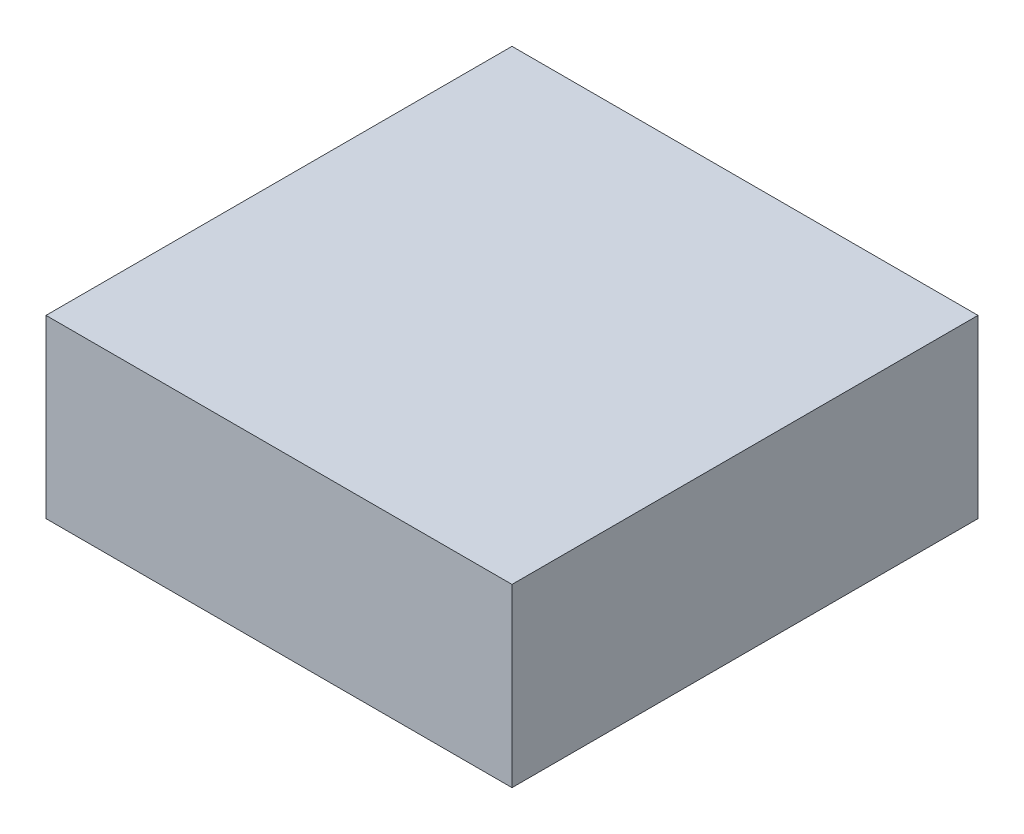
ISO-10303-21;
HEADER;
FILE_DESCRIPTION(('STEP AP214'),'2;1');
FILE_NAME('part.step','',(''),(''),'','','');
FILE_SCHEMA(('AUTOMOTIVE_DESIGN { 1 0 10303 214 1 1 1 1 }'));
ENDSEC;
DATA;
#1=APPLICATION_CONTEXT('core data for automotive mechanical design processes');
#2=APPLICATION_PROTOCOL_DEFINITION('international standard','automotive_design',2000,#1);
#3=PRODUCT_CONTEXT('',#1,'mechanical');
#4=PRODUCT('Part','Part','',(#3));
#5=PRODUCT_RELATED_PRODUCT_CATEGORY('part','',(#4));
#6=PRODUCT_DEFINITION_FORMATION('','',#4);
#7=PRODUCT_DEFINITION_CONTEXT('part definition',#1,'design');
#8=PRODUCT_DEFINITION('design','',#6,#7);
#9=PRODUCT_DEFINITION_SHAPE('','',#8);
#10=(LENGTH_UNIT() NAMED_UNIT(*) SI_UNIT(.MILLI.,.METRE.));
#11=(NAMED_UNIT(*) PLANE_ANGLE_UNIT() SI_UNIT($,.RADIAN.));
#12=(NAMED_UNIT(*) SI_UNIT($,.STERADIAN.) SOLID_ANGLE_UNIT());
#13=UNCERTAINTY_MEASURE_WITH_UNIT(LENGTH_MEASURE(1.E-05),#10,'distance_accuracy_value','');
#14=(GEOMETRIC_REPRESENTATION_CONTEXT(3) GLOBAL_UNCERTAINTY_ASSIGNED_CONTEXT((#13)) GLOBAL_UNIT_ASSIGNED_CONTEXT((#10,
#11,#12)) REPRESENTATION_CONTEXT('',''));
#15=CARTESIAN_POINT('',(0.,0.,0.));
#16=DIRECTION('',(0.,0.,1.));
#17=DIRECTION('',(1.,0.,0.));
#18=AXIS2_PLACEMENT_3D('',#15,#16,#17);
#19=CARTESIAN_POINT('',(-57.5,40.,62.5));
#20=DIRECTION('',(0.,1.,0.));
#21=DIRECTION('',(1.,0.,0.));
#22=AXIS2_PLACEMENT_3D('',#19,#20,#21);
#23=PLANE('',#22);
#24=DIRECTION('',(-1.,0.,0.));
#25=VECTOR('',#24,1.);
#26=CARTESIAN_POINT('',(-35.,40.,85.));
#27=LINE('',#26,#25);
#28=CARTESIAN_POINT('',(-35.,40.,85.));
#29=VERTEX_POINT('',#28);
#30=CARTESIAN_POINT('',(-80.,40.,85.));
#31=VERTEX_POINT('',#30);
#32=EDGE_CURVE('E27',#29,#31,#27,.T.);
#33=ORIENTED_EDGE('',*,*,#32,.T.);
#34=DIRECTION('',(0.,0.,-1.));
#35=VECTOR('',#34,1.);
#36=CARTESIAN_POINT('',(-80.,40.,85.));
#37=LINE('',#36,#35);
#38=CARTESIAN_POINT('',(-80.,40.,40.));
#39=VERTEX_POINT('',#38);
#40=EDGE_CURVE('E73',#31,#39,#37,.T.);
#41=ORIENTED_EDGE('',*,*,#40,.T.);
#42=DIRECTION('',(1.,0.,0.));
#43=VECTOR('',#42,1.);
#44=CARTESIAN_POINT('',(-80.,40.,40.));
#45=LINE('',#44,#43);
#46=CARTESIAN_POINT('',(-35.,40.,40.));
#47=VERTEX_POINT('',#46);
#48=EDGE_CURVE('E98',#39,#47,#45,.T.);
#49=ORIENTED_EDGE('',*,*,#48,.T.);
#50=DIRECTION('',(0.,0.,1.));
#51=VECTOR('',#50,1.);
#52=CARTESIAN_POINT('',(-35.,40.,40.));
#53=LINE('',#52,#51);
#54=EDGE_CURVE('E72',#47,#29,#53,.T.);
#55=ORIENTED_EDGE('',*,*,#54,.T.);
#56=EDGE_LOOP('',(#33,#41,#49,#55));
#57=FACE_BOUND('',#56,.T.);
#58=ADVANCED_FACE('F17',(#57),#23,.F.);
#59=CARTESIAN_POINT('',(-57.5,57.,62.5));
#60=DIRECTION('',(0.,1.,0.));
#61=DIRECTION('',(1.,0.,0.));
#62=AXIS2_PLACEMENT_3D('',#59,#60,#61);
#63=PLANE('',#62);
#64=DIRECTION('',(1.,0.,0.));
#65=VECTOR('',#64,1.);
#66=CARTESIAN_POINT('',(-35.,57.,85.));
#67=LINE('',#66,#65);
#68=CARTESIAN_POINT('',(-80.,57.,85.));
#69=VERTEX_POINT('',#68);
#70=CARTESIAN_POINT('',(-35.,57.,85.));
#71=VERTEX_POINT('',#70);
#72=EDGE_CURVE('E11',#69,#71,#67,.T.);
#73=ORIENTED_EDGE('',*,*,#72,.T.);
#74=DIRECTION('',(0.,0.,-1.));
#75=VECTOR('',#74,1.);
#76=CARTESIAN_POINT('',(-35.,57.,40.));
#77=LINE('',#76,#75);
#78=CARTESIAN_POINT('',(-35.,57.,40.));
#79=VERTEX_POINT('',#78);
#80=EDGE_CURVE('E108',#71,#79,#77,.T.);
#81=ORIENTED_EDGE('',*,*,#80,.T.);
#82=DIRECTION('',(-1.,0.,0.));
#83=VECTOR('',#82,1.);
#84=CARTESIAN_POINT('',(-80.,57.,40.));
#85=LINE('',#84,#83);
#86=CARTESIAN_POINT('',(-80.,57.,40.));
#87=VERTEX_POINT('',#86);
#88=EDGE_CURVE('E101',#79,#87,#85,.T.);
#89=ORIENTED_EDGE('',*,*,#88,.T.);
#90=DIRECTION('',(0.,0.,1.));
#91=VECTOR('',#90,1.);
#92=CARTESIAN_POINT('',(-80.,57.,85.));
#93=LINE('',#92,#91);
#94=EDGE_CURVE('E83',#87,#69,#93,.T.);
#95=ORIENTED_EDGE('',*,*,#94,.T.);
#96=EDGE_LOOP('',(#73,#81,#89,#95));
#97=FACE_BOUND('',#96,.T.);
#98=ADVANCED_FACE('F121',(#97),#63,.T.);
#99=CARTESIAN_POINT('',(-80.,40.,85.));
#100=DIRECTION('',(0.,0.,1.));
#101=DIRECTION('',(1.,0.,0.));
#102=AXIS2_PLACEMENT_3D('',#99,#100,#101);
#103=PLANE('',#102);
#104=ORIENTED_EDGE('',*,*,#32,.F.);
#105=DIRECTION('',(0.,1.,0.));
#106=VECTOR('',#105,1.);
#107=CARTESIAN_POINT('',(-35.,40.,85.));
#108=LINE('',#107,#106);
#109=EDGE_CURVE('E20',#29,#71,#108,.T.);
#110=ORIENTED_EDGE('',*,*,#109,.T.);
#111=ORIENTED_EDGE('',*,*,#72,.F.);
#112=DIRECTION('',(0.,1.,0.));
#113=VECTOR('',#112,1.);
#114=CARTESIAN_POINT('',(-80.,40.,85.));
#115=LINE('',#114,#113);
#116=EDGE_CURVE('E77',#31,#69,#115,.T.);
#117=ORIENTED_EDGE('',*,*,#116,.F.);
#118=EDGE_LOOP('',(#104,#110,#111,#117));
#119=FACE_BOUND('',#118,.T.);
#120=ADVANCED_FACE('F78',(#119),#103,.T.);
#121=CARTESIAN_POINT('',(-35.,40.,85.));
#122=DIRECTION('',(1.,0.,0.));
#123=DIRECTION('',(0.,1.,0.));
#124=AXIS2_PLACEMENT_3D('',#121,#122,#123);
#125=PLANE('',#124);
#126=ORIENTED_EDGE('',*,*,#54,.F.);
#127=DIRECTION('',(0.,1.,0.));
#128=VECTOR('',#127,1.);
#129=CARTESIAN_POINT('',(-35.,40.,40.));
#130=LINE('',#129,#128);
#131=EDGE_CURVE('E102',#47,#79,#130,.T.);
#132=ORIENTED_EDGE('',*,*,#131,.T.);
#133=ORIENTED_EDGE('',*,*,#80,.F.);
#134=ORIENTED_EDGE('',*,*,#109,.F.);
#135=EDGE_LOOP('',(#126,#132,#133,#134));
#136=FACE_BOUND('',#135,.T.);
#137=ADVANCED_FACE('F116',(#136),#125,.T.);
#138=CARTESIAN_POINT('',(-35.,40.,40.));
#139=DIRECTION('',(0.,0.,-1.));
#140=DIRECTION('',(0.,-1.,0.));
#141=AXIS2_PLACEMENT_3D('',#138,#139,#140);
#142=PLANE('',#141);
#143=ORIENTED_EDGE('',*,*,#48,.F.);
#144=DIRECTION('',(0.,1.,0.));
#145=VECTOR('',#144,1.);
#146=CARTESIAN_POINT('',(-80.,40.,40.));
#147=LINE('',#146,#145);
#148=EDGE_CURVE('E86',#39,#87,#147,.T.);
#149=ORIENTED_EDGE('',*,*,#148,.T.);
#150=ORIENTED_EDGE('',*,*,#88,.F.);
#151=ORIENTED_EDGE('',*,*,#131,.F.);
#152=EDGE_LOOP('',(#143,#149,#150,#151));
#153=FACE_BOUND('',#152,.T.);
#154=ADVANCED_FACE('F120',(#153),#142,.T.);
#155=CARTESIAN_POINT('',(-80.,40.,40.));
#156=DIRECTION('',(-1.,0.,0.));
#157=DIRECTION('',(0.,0.,1.));
#158=AXIS2_PLACEMENT_3D('',#155,#156,#157);
#159=PLANE('',#158);
#160=ORIENTED_EDGE('',*,*,#40,.F.);
#161=ORIENTED_EDGE('',*,*,#116,.T.);
#162=ORIENTED_EDGE('',*,*,#94,.F.);
#163=ORIENTED_EDGE('',*,*,#148,.F.);
#164=EDGE_LOOP('',(#160,#161,#162,#163));
#165=FACE_BOUND('',#164,.T.);
#166=ADVANCED_FACE('F88',(#165),#159,.T.);
#167=CLOSED_SHELL('',(#58,#98,#120,#137,#154,#166));
#168=MANIFOLD_SOLID_BREP('B1',#167);
#169=ADVANCED_BREP_SHAPE_REPRESENTATION('',(#18,#168),#14);
#170=SHAPE_DEFINITION_REPRESENTATION(#9,#169);
ENDSEC;
END-ISO-10303-21;
